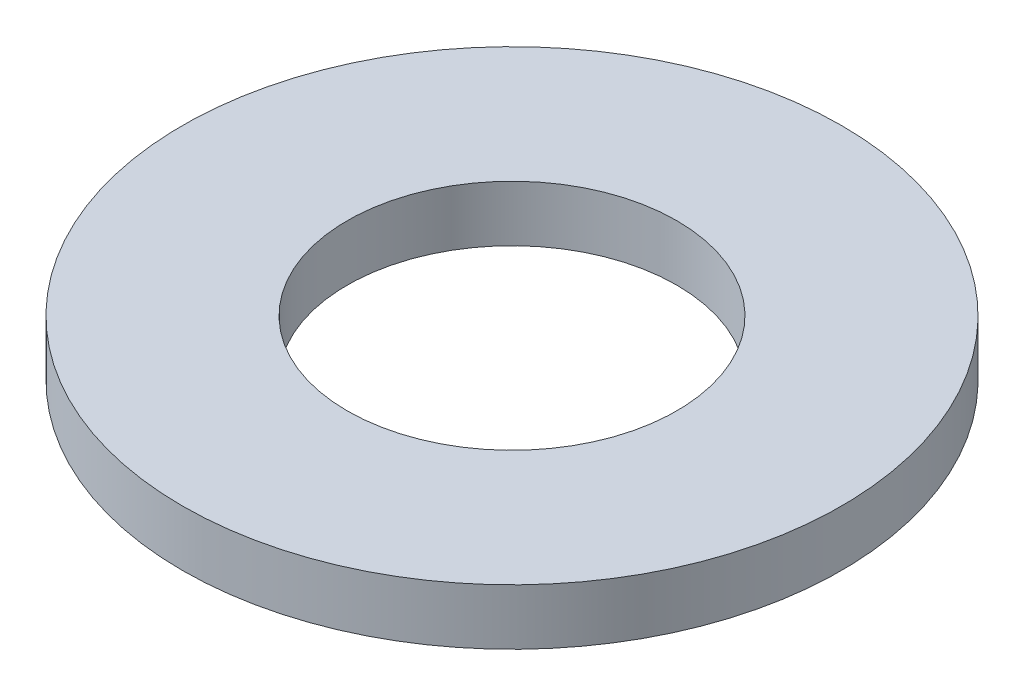
ISO-10303-21;
HEADER;
FILE_DESCRIPTION(('STEP AP214'),'2;1');
FILE_NAME('part.step','',(''),(''),'','','');
FILE_SCHEMA(('AUTOMOTIVE_DESIGN { 1 0 10303 214 1 1 1 1 }'));
ENDSEC;
DATA;
#1=APPLICATION_CONTEXT('core data for automotive mechanical design processes');
#2=APPLICATION_PROTOCOL_DEFINITION('international standard','automotive_design',2000,#1);
#3=PRODUCT_CONTEXT('',#1,'mechanical');
#4=PRODUCT('Part','Part','',(#3));
#5=PRODUCT_RELATED_PRODUCT_CATEGORY('part','',(#4));
#6=PRODUCT_DEFINITION_FORMATION('','',#4);
#7=PRODUCT_DEFINITION_CONTEXT('part definition',#1,'design');
#8=PRODUCT_DEFINITION('design','',#6,#7);
#9=PRODUCT_DEFINITION_SHAPE('','',#8);
#10=(LENGTH_UNIT() NAMED_UNIT(*) SI_UNIT(.MILLI.,.METRE.));
#11=(NAMED_UNIT(*) PLANE_ANGLE_UNIT() SI_UNIT($,.RADIAN.));
#12=(NAMED_UNIT(*) SI_UNIT($,.STERADIAN.) SOLID_ANGLE_UNIT());
#13=UNCERTAINTY_MEASURE_WITH_UNIT(LENGTH_MEASURE(1.E-05),#10,'distance_accuracy_value','');
#14=(GEOMETRIC_REPRESENTATION_CONTEXT(3) GLOBAL_UNCERTAINTY_ASSIGNED_CONTEXT((#13)) GLOBAL_UNIT_ASSIGNED_CONTEXT((#10,
#11,#12)) REPRESENTATION_CONTEXT('',''));
#15=CARTESIAN_POINT('',(0.,0.,0.));
#16=DIRECTION('',(0.,0.,1.));
#17=DIRECTION('',(1.,0.,0.));
#18=AXIS2_PLACEMENT_3D('',#15,#16,#17);
#19=CARTESIAN_POINT('',(0.,10.,0.));
#20=DIRECTION('',(0.,1.,0.));
#21=DIRECTION('',(0.,0.,1.));
#22=AXIS2_PLACEMENT_3D('',#19,#20,#21);
#23=PLANE('',#22);
#24=CARTESIAN_POINT('',(0.,10.,0.));
#25=DIRECTION('',(0.,1.,0.));
#26=DIRECTION('',(0.,0.,1.));
#27=AXIS2_PLACEMENT_3D('',#24,#25,#26);
#28=CIRCLE('',#27,59.);
#29=CARTESIAN_POINT('',(0.,10.,59.));
#30=VERTEX_POINT('',#29);
#31=EDGE_CURVE('E10',#30,#30,#28,.T.);
#32=ORIENTED_EDGE('',*,*,#31,.T.);
#33=EDGE_LOOP('',(#32));
#34=FACE_BOUND('',#33,.T.);
#35=CARTESIAN_POINT('',(0.,10.,0.));
#36=DIRECTION('',(0.,1.,0.));
#37=DIRECTION('',(0.,0.,1.));
#38=AXIS2_PLACEMENT_3D('',#35,#36,#37);
#39=CIRCLE('',#38,29.5);
#40=CARTESIAN_POINT('',(0.,10.,29.5));
#41=VERTEX_POINT('',#40);
#42=EDGE_CURVE('E48',#41,#41,#39,.T.);
#43=ORIENTED_EDGE('',*,*,#42,.F.);
#44=EDGE_LOOP('',(#43));
#45=FACE_BOUND('',#44,.T.);
#46=ADVANCED_FACE('F37',(#34,#45),#23,.T.);
#47=CARTESIAN_POINT('',(0.,0.,0.));
#48=DIRECTION('',(0.,1.,0.));
#49=DIRECTION('',(0.,0.,1.));
#50=AXIS2_PLACEMENT_3D('',#47,#48,#49);
#51=PLANE('',#50);
#52=CARTESIAN_POINT('',(0.,0.,0.));
#53=DIRECTION('',(0.,1.,0.));
#54=DIRECTION('',(0.,0.,1.));
#55=AXIS2_PLACEMENT_3D('',#52,#53,#54);
#56=CIRCLE('',#55,59.);
#57=CARTESIAN_POINT('',(0.,0.,59.));
#58=VERTEX_POINT('',#57);
#59=EDGE_CURVE('E41',#58,#58,#56,.T.);
#60=ORIENTED_EDGE('',*,*,#59,.F.);
#61=EDGE_LOOP('',(#60));
#62=FACE_BOUND('',#61,.T.);
#63=CARTESIAN_POINT('',(0.,0.,0.));
#64=DIRECTION('',(0.,1.,0.));
#65=DIRECTION('',(0.,0.,1.));
#66=AXIS2_PLACEMENT_3D('',#63,#64,#65);
#67=CIRCLE('',#66,29.5);
#68=CARTESIAN_POINT('',(0.,0.,29.5));
#69=VERTEX_POINT('',#68);
#70=EDGE_CURVE('E50',#69,#69,#67,.T.);
#71=ORIENTED_EDGE('',*,*,#70,.T.);
#72=EDGE_LOOP('',(#71));
#73=FACE_BOUND('',#72,.T.);
#74=ADVANCED_FACE('F60',(#62,#73),#51,.F.);
#75=CARTESIAN_POINT('',(0.,10.,0.));
#76=DIRECTION('',(0.,-1.,0.));
#77=DIRECTION('',(0.,0.,-1.));
#78=AXIS2_PLACEMENT_3D('',#75,#76,#77);
#79=CYLINDRICAL_SURFACE('',#78,59.);
#80=ORIENTED_EDGE('',*,*,#31,.F.);
#81=EDGE_LOOP('',(#80));
#82=FACE_BOUND('',#81,.T.);
#83=ORIENTED_EDGE('',*,*,#59,.T.);
#84=EDGE_LOOP('',(#83));
#85=FACE_BOUND('',#84,.T.);
#86=ADVANCED_FACE('F39',(#82,#85),#79,.T.);
#87=CARTESIAN_POINT('',(0.,10.,0.));
#88=DIRECTION('',(0.,-1.,0.));
#89=DIRECTION('',(0.,0.,-1.));
#90=AXIS2_PLACEMENT_3D('',#87,#88,#89);
#91=CYLINDRICAL_SURFACE('',#90,29.5);
#92=ORIENTED_EDGE('',*,*,#42,.T.);
#93=EDGE_LOOP('',(#92));
#94=FACE_BOUND('',#93,.T.);
#95=ORIENTED_EDGE('',*,*,#70,.F.);
#96=EDGE_LOOP('',(#95));
#97=FACE_BOUND('',#96,.T.);
#98=ADVANCED_FACE('F56',(#94,#97),#91,.F.);
#99=CLOSED_SHELL('',(#46,#74,#86,#98));
#100=MANIFOLD_SOLID_BREP('B2',#99);
#101=ADVANCED_BREP_SHAPE_REPRESENTATION('',(#18,#100),#14);
#102=SHAPE_DEFINITION_REPRESENTATION(#9,#101);
ENDSEC;
END-ISO-10303-21;
